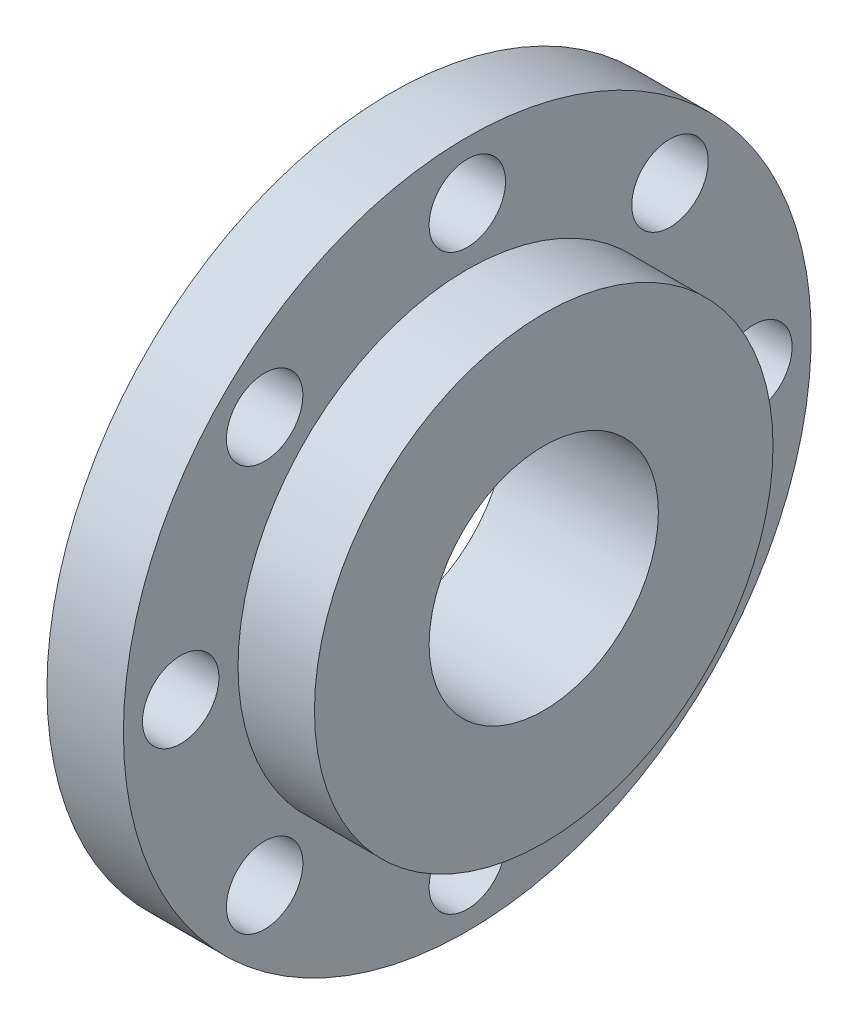
ISO-10303-21;
HEADER;
FILE_DESCRIPTION(('STEP AP214'),'2;1');
FILE_NAME('part.step','',(''),(''),'','','');
FILE_SCHEMA(('AUTOMOTIVE_DESIGN { 1 0 10303 214 1 1 1 1 }'));
ENDSEC;
DATA;
#1=APPLICATION_CONTEXT('core data for automotive mechanical design processes');
#2=APPLICATION_PROTOCOL_DEFINITION('international standard','automotive_design',2000,#1);
#3=PRODUCT_CONTEXT('',#1,'mechanical');
#4=PRODUCT('Part','Part','',(#3));
#5=PRODUCT_RELATED_PRODUCT_CATEGORY('part','',(#4));
#6=PRODUCT_DEFINITION_FORMATION('','',#4);
#7=PRODUCT_DEFINITION_CONTEXT('part definition',#1,'design');
#8=PRODUCT_DEFINITION('design','',#6,#7);
#9=PRODUCT_DEFINITION_SHAPE('','',#8);
#10=(LENGTH_UNIT() NAMED_UNIT(*) SI_UNIT(.MILLI.,.METRE.));
#11=(NAMED_UNIT(*) PLANE_ANGLE_UNIT() SI_UNIT($,.RADIAN.));
#12=(NAMED_UNIT(*) SI_UNIT($,.STERADIAN.) SOLID_ANGLE_UNIT());
#13=UNCERTAINTY_MEASURE_WITH_UNIT(LENGTH_MEASURE(1.E-05),#10,'distance_accuracy_value','');
#14=(GEOMETRIC_REPRESENTATION_CONTEXT(3) GLOBAL_UNCERTAINTY_ASSIGNED_CONTEXT((#13)) GLOBAL_UNIT_ASSIGNED_CONTEXT((#10,
#11,#12)) REPRESENTATION_CONTEXT('',''));
#15=CARTESIAN_POINT('',(0.,0.,0.));
#16=DIRECTION('',(0.,0.,1.));
#17=DIRECTION('',(1.,0.,0.));
#18=AXIS2_PLACEMENT_3D('',#15,#16,#17);
#19=CARTESIAN_POINT('',(0.,45.,0.));
#20=DIRECTION('',(1.,0.,0.));
#21=DIRECTION('',(0.,0.,-1.));
#22=AXIS2_PLACEMENT_3D('',#19,#20,#21);
#23=PLANE('',#22);
#24=CARTESIAN_POINT('',(0.,37.5,0.));
#25=DIRECTION('',(-1.,0.,0.));
#26=DIRECTION('',(0.,0.,1.));
#27=AXIS2_PLACEMENT_3D('',#24,#25,#26);
#28=CIRCLE('',#27,5.);
#29=CARTESIAN_POINT('',(0.,37.5,5.));
#30=VERTEX_POINT('',#29);
#31=EDGE_CURVE('E50',#30,#30,#28,.T.);
#32=ORIENTED_EDGE('',*,*,#31,.F.);
#33=EDGE_LOOP('',(#32));
#34=FACE_BOUND('',#33,.T.);
#35=CARTESIAN_POINT('',(0.,26.5165042944955,26.5165042944955));
#36=DIRECTION('',(-1.,0.,0.));
#37=DIRECTION('',(0.,0.,1.));
#38=AXIS2_PLACEMENT_3D('',#35,#36,#37);
#39=CIRCLE('',#38,5.);
#40=CARTESIAN_POINT('',(0.,26.5165042944955,31.5165042944955));
#41=VERTEX_POINT('',#40);
#42=EDGE_CURVE('E149',#41,#41,#39,.T.);
#43=ORIENTED_EDGE('',*,*,#42,.F.);
#44=EDGE_LOOP('',(#43));
#45=FACE_BOUND('',#44,.T.);
#46=CARTESIAN_POINT('',(0.,0.,37.5));
#47=DIRECTION('',(-1.,0.,0.));
#48=DIRECTION('',(0.,0.,1.));
#49=AXIS2_PLACEMENT_3D('',#46,#47,#48);
#50=CIRCLE('',#49,5.);
#51=CARTESIAN_POINT('',(0.,0.,42.5));
#52=VERTEX_POINT('',#51);
#53=EDGE_CURVE('E152',#52,#52,#50,.T.);
#54=ORIENTED_EDGE('',*,*,#53,.F.);
#55=EDGE_LOOP('',(#54));
#56=FACE_BOUND('',#55,.T.);
#57=CARTESIAN_POINT('',(0.,-26.5165042944955,26.5165042944955));
#58=DIRECTION('',(-1.,0.,0.));
#59=DIRECTION('',(0.,0.,1.));
#60=AXIS2_PLACEMENT_3D('',#57,#58,#59);
#61=CIRCLE('',#60,5.);
#62=CARTESIAN_POINT('',(0.,-26.5165042944955,31.5165042944955));
#63=VERTEX_POINT('',#62);
#64=EDGE_CURVE('E157',#63,#63,#61,.T.);
#65=ORIENTED_EDGE('',*,*,#64,.F.);
#66=EDGE_LOOP('',(#65));
#67=FACE_BOUND('',#66,.T.);
#68=CARTESIAN_POINT('',(0.,-37.5,0.));
#69=DIRECTION('',(-1.,0.,0.));
#70=DIRECTION('',(0.,0.,1.));
#71=AXIS2_PLACEMENT_3D('',#68,#69,#70);
#72=CIRCLE('',#71,5.);
#73=CARTESIAN_POINT('',(0.,-37.5,5.00000000000001));
#74=VERTEX_POINT('',#73);
#75=EDGE_CURVE('E160',#74,#74,#72,.T.);
#76=ORIENTED_EDGE('',*,*,#75,.F.);
#77=EDGE_LOOP('',(#76));
#78=FACE_BOUND('',#77,.T.);
#79=CARTESIAN_POINT('',(0.,-26.5165042944955,-26.5165042944955));
#80=DIRECTION('',(-1.,0.,0.));
#81=DIRECTION('',(0.,0.,1.));
#82=AXIS2_PLACEMENT_3D('',#79,#80,#81);
#83=CIRCLE('',#82,5.);
#84=CARTESIAN_POINT('',(0.,-26.5165042944955,-21.5165042944955));
#85=VERTEX_POINT('',#84);
#86=EDGE_CURVE('E163',#85,#85,#83,.T.);
#87=ORIENTED_EDGE('',*,*,#86,.F.);
#88=EDGE_LOOP('',(#87));
#89=FACE_BOUND('',#88,.T.);
#90=CARTESIAN_POINT('',(0.,0.,-37.5));
#91=DIRECTION('',(-1.,0.,0.));
#92=DIRECTION('',(0.,0.,1.));
#93=AXIS2_PLACEMENT_3D('',#90,#91,#92);
#94=CIRCLE('',#93,5.);
#95=CARTESIAN_POINT('',(0.,0.,-32.5));
#96=VERTEX_POINT('',#95);
#97=EDGE_CURVE('E165',#96,#96,#94,.T.);
#98=ORIENTED_EDGE('',*,*,#97,.F.);
#99=EDGE_LOOP('',(#98));
#100=FACE_BOUND('',#99,.T.);
#101=CARTESIAN_POINT('',(0.,26.5165042944955,-26.5165042944955));
#102=DIRECTION('',(-1.,0.,0.));
#103=DIRECTION('',(0.,0.,1.));
#104=AXIS2_PLACEMENT_3D('',#101,#102,#103);
#105=CIRCLE('',#104,5.);
#106=CARTESIAN_POINT('',(0.,26.5165042944955,-21.5165042944955));
#107=VERTEX_POINT('',#106);
#108=EDGE_CURVE('E81',#107,#107,#105,.T.);
#109=ORIENTED_EDGE('',*,*,#108,.F.);
#110=EDGE_LOOP('',(#109));
#111=FACE_BOUND('',#110,.T.);
#112=CARTESIAN_POINT('',(0.,0.,0.));
#113=DIRECTION('',(-1.,0.,0.));
#114=DIRECTION('',(0.,0.,1.));
#115=AXIS2_PLACEMENT_3D('',#112,#113,#114);
#116=CIRCLE('',#115,15.);
#117=CARTESIAN_POINT('',(0.,0.,15.));
#118=VERTEX_POINT('',#117);
#119=EDGE_CURVE('E10',#118,#118,#116,.T.);
#120=ORIENTED_EDGE('',*,*,#119,.F.);
#121=EDGE_LOOP('',(#120));
#122=FACE_BOUND('',#121,.T.);
#123=CARTESIAN_POINT('',(0.,0.,0.));
#124=DIRECTION('',(-1.,0.,0.));
#125=DIRECTION('',(0.,0.,1.));
#126=AXIS2_PLACEMENT_3D('',#123,#124,#125);
#127=CIRCLE('',#126,45.);
#128=CARTESIAN_POINT('',(0.,0.,45.));
#129=VERTEX_POINT('',#128);
#130=EDGE_CURVE('E69',#129,#129,#127,.T.);
#131=ORIENTED_EDGE('',*,*,#130,.T.);
#132=EDGE_LOOP('',(#131));
#133=FACE_BOUND('',#132,.T.);
#134=ADVANCED_FACE('F30',(#34,#45,#56,#67,#78,#89,#100,#111,#122,#133),#23,.F.);
#135=CARTESIAN_POINT('',(0.,0.,0.));
#136=DIRECTION('',(-1.,0.,0.));
#137=DIRECTION('',(0.,0.,1.));
#138=AXIS2_PLACEMENT_3D('',#135,#136,#137);
#139=CYLINDRICAL_SURFACE('',#138,15.);
#140=CARTESIAN_POINT('',(20.,0.,0.));
#141=DIRECTION('',(-1.,0.,0.));
#142=DIRECTION('',(0.,0.,1.));
#143=AXIS2_PLACEMENT_3D('',#140,#141,#142);
#144=CIRCLE('',#143,15.);
#145=CARTESIAN_POINT('',(20.,0.,15.));
#146=VERTEX_POINT('',#145);
#147=EDGE_CURVE('E37',#146,#146,#144,.T.);
#148=ORIENTED_EDGE('',*,*,#147,.F.);
#149=EDGE_LOOP('',(#148));
#150=FACE_BOUND('',#149,.T.);
#151=ORIENTED_EDGE('',*,*,#119,.T.);
#152=EDGE_LOOP('',(#151));
#153=FACE_BOUND('',#152,.T.);
#154=ADVANCED_FACE('F93',(#150,#153),#139,.F.);
#155=CARTESIAN_POINT('',(20.,15.,0.));
#156=DIRECTION('',(-1.,0.,0.));
#157=DIRECTION('',(0.,0.,1.));
#158=AXIS2_PLACEMENT_3D('',#155,#156,#157);
#159=PLANE('',#158);
#160=CARTESIAN_POINT('',(20.,0.,0.));
#161=DIRECTION('',(-1.,0.,0.));
#162=DIRECTION('',(0.,0.,1.));
#163=AXIS2_PLACEMENT_3D('',#160,#161,#162);
#164=CIRCLE('',#163,30.);
#165=CARTESIAN_POINT('',(20.,0.,30.));
#166=VERTEX_POINT('',#165);
#167=EDGE_CURVE('E42',#166,#166,#164,.T.);
#168=ORIENTED_EDGE('',*,*,#167,.F.);
#169=EDGE_LOOP('',(#168));
#170=FACE_BOUND('',#169,.T.);
#171=ORIENTED_EDGE('',*,*,#147,.T.);
#172=EDGE_LOOP('',(#171));
#173=FACE_BOUND('',#172,.T.);
#174=ADVANCED_FACE('F90',(#170,#173),#159,.F.);
#175=CARTESIAN_POINT('',(0.,0.,0.));
#176=DIRECTION('',(-1.,0.,0.));
#177=DIRECTION('',(0.,0.,1.));
#178=AXIS2_PLACEMENT_3D('',#175,#176,#177);
#179=CYLINDRICAL_SURFACE('',#178,30.);
#180=CARTESIAN_POINT('',(10.,0.,0.));
#181=DIRECTION('',(-1.,0.,0.));
#182=DIRECTION('',(0.,0.,1.));
#183=AXIS2_PLACEMENT_3D('',#180,#181,#182);
#184=CIRCLE('',#183,30.);
#185=CARTESIAN_POINT('',(10.,0.,30.));
#186=VERTEX_POINT('',#185);
#187=EDGE_CURVE('E78',#186,#186,#184,.T.);
#188=ORIENTED_EDGE('',*,*,#187,.F.);
#189=EDGE_LOOP('',(#188));
#190=FACE_BOUND('',#189,.T.);
#191=ORIENTED_EDGE('',*,*,#167,.T.);
#192=EDGE_LOOP('',(#191));
#193=FACE_BOUND('',#192,.T.);
#194=ADVANCED_FACE('F88',(#190,#193),#179,.T.);
#195=CARTESIAN_POINT('',(10.,30.,0.));
#196=DIRECTION('',(-1.,0.,0.));
#197=DIRECTION('',(0.,0.,1.));
#198=AXIS2_PLACEMENT_3D('',#195,#196,#197);
#199=PLANE('',#198);
#200=CARTESIAN_POINT('',(10.,37.5,0.));
#201=DIRECTION('',(-1.,0.,0.));
#202=DIRECTION('',(0.,0.,1.));
#203=AXIS2_PLACEMENT_3D('',#200,#201,#202);
#204=CIRCLE('',#203,5.);
#205=CARTESIAN_POINT('',(10.,37.5,5.));
#206=VERTEX_POINT('',#205);
#207=EDGE_CURVE('E33',#206,#206,#204,.T.);
#208=ORIENTED_EDGE('',*,*,#207,.T.);
#209=EDGE_LOOP('',(#208));
#210=FACE_BOUND('',#209,.T.);
#211=CARTESIAN_POINT('',(10.,26.5165042944955,26.5165042944955));
#212=DIRECTION('',(-1.,0.,0.));
#213=DIRECTION('',(0.,0.,1.));
#214=AXIS2_PLACEMENT_3D('',#211,#212,#213);
#215=CIRCLE('',#214,5.);
#216=CARTESIAN_POINT('',(10.,26.5165042944955,31.5165042944955));
#217=VERTEX_POINT('',#216);
#218=EDGE_CURVE('E64',#217,#217,#215,.T.);
#219=ORIENTED_EDGE('',*,*,#218,.T.);
#220=EDGE_LOOP('',(#219));
#221=FACE_BOUND('',#220,.T.);
#222=CARTESIAN_POINT('',(10.,0.,37.5));
#223=DIRECTION('',(-1.,0.,0.));
#224=DIRECTION('',(0.,0.,1.));
#225=AXIS2_PLACEMENT_3D('',#222,#223,#224);
#226=CIRCLE('',#225,5.);
#227=CARTESIAN_POINT('',(10.,0.,42.5));
#228=VERTEX_POINT('',#227);
#229=EDGE_CURVE('E62',#228,#228,#226,.T.);
#230=ORIENTED_EDGE('',*,*,#229,.T.);
#231=EDGE_LOOP('',(#230));
#232=FACE_BOUND('',#231,.T.);
#233=CARTESIAN_POINT('',(10.,-26.5165042944955,26.5165042944955));
#234=DIRECTION('',(-1.,0.,0.));
#235=DIRECTION('',(0.,0.,1.));
#236=AXIS2_PLACEMENT_3D('',#233,#234,#235);
#237=CIRCLE('',#236,5.);
#238=CARTESIAN_POINT('',(10.,-26.5165042944955,31.5165042944955));
#239=VERTEX_POINT('',#238);
#240=EDGE_CURVE('E59',#239,#239,#237,.T.);
#241=ORIENTED_EDGE('',*,*,#240,.T.);
#242=EDGE_LOOP('',(#241));
#243=FACE_BOUND('',#242,.T.);
#244=CARTESIAN_POINT('',(10.,-37.5,0.));
#245=DIRECTION('',(-1.,0.,0.));
#246=DIRECTION('',(0.,0.,1.));
#247=AXIS2_PLACEMENT_3D('',#244,#245,#246);
#248=CIRCLE('',#247,5.);
#249=CARTESIAN_POINT('',(10.,-37.5,5.00000000000001));
#250=VERTEX_POINT('',#249);
#251=EDGE_CURVE('E56',#250,#250,#248,.T.);
#252=ORIENTED_EDGE('',*,*,#251,.T.);
#253=EDGE_LOOP('',(#252));
#254=FACE_BOUND('',#253,.T.);
#255=CARTESIAN_POINT('',(10.,-26.5165042944955,-26.5165042944955));
#256=DIRECTION('',(-1.,0.,0.));
#257=DIRECTION('',(0.,0.,1.));
#258=AXIS2_PLACEMENT_3D('',#255,#256,#257);
#259=CIRCLE('',#258,5.);
#260=CARTESIAN_POINT('',(10.,-26.5165042944955,-21.5165042944955));
#261=VERTEX_POINT('',#260);
#262=EDGE_CURVE('E53',#261,#261,#259,.T.);
#263=ORIENTED_EDGE('',*,*,#262,.T.);
#264=EDGE_LOOP('',(#263));
#265=FACE_BOUND('',#264,.T.);
#266=CARTESIAN_POINT('',(10.,0.,-37.5));
#267=DIRECTION('',(-1.,0.,0.));
#268=DIRECTION('',(0.,0.,1.));
#269=AXIS2_PLACEMENT_3D('',#266,#267,#268);
#270=CIRCLE('',#269,5.);
#271=CARTESIAN_POINT('',(10.,0.,-32.5));
#272=VERTEX_POINT('',#271);
#273=EDGE_CURVE('E49',#272,#272,#270,.T.);
#274=ORIENTED_EDGE('',*,*,#273,.T.);
#275=EDGE_LOOP('',(#274));
#276=FACE_BOUND('',#275,.T.);
#277=CARTESIAN_POINT('',(10.,26.5165042944955,-26.5165042944955));
#278=DIRECTION('',(-1.,0.,0.));
#279=DIRECTION('',(0.,0.,1.));
#280=AXIS2_PLACEMENT_3D('',#277,#278,#279);
#281=CIRCLE('',#280,5.);
#282=CARTESIAN_POINT('',(10.,26.5165042944955,-21.5165042944955));
#283=VERTEX_POINT('',#282);
#284=EDGE_CURVE('E46',#283,#283,#281,.T.);
#285=ORIENTED_EDGE('',*,*,#284,.T.);
#286=EDGE_LOOP('',(#285));
#287=FACE_BOUND('',#286,.T.);
#288=CARTESIAN_POINT('',(10.,0.,0.));
#289=DIRECTION('',(-1.,0.,0.));
#290=DIRECTION('',(0.,0.,1.));
#291=AXIS2_PLACEMENT_3D('',#288,#289,#290);
#292=CIRCLE('',#291,45.);
#293=CARTESIAN_POINT('',(10.,0.,45.));
#294=VERTEX_POINT('',#293);
#295=EDGE_CURVE('E73',#294,#294,#292,.T.);
#296=ORIENTED_EDGE('',*,*,#295,.F.);
#297=EDGE_LOOP('',(#296));
#298=FACE_BOUND('',#297,.T.);
#299=ORIENTED_EDGE('',*,*,#187,.T.);
#300=EDGE_LOOP('',(#299));
#301=FACE_BOUND('',#300,.T.);
#302=ADVANCED_FACE('F105',(#210,#221,#232,#243,#254,#265,#276,#287,#298,#301),#199,.F.);
#303=CARTESIAN_POINT('',(0.,0.,0.));
#304=DIRECTION('',(-1.,0.,0.));
#305=DIRECTION('',(0.,0.,1.));
#306=AXIS2_PLACEMENT_3D('',#303,#304,#305);
#307=CYLINDRICAL_SURFACE('',#306,45.);
#308=ORIENTED_EDGE('',*,*,#130,.F.);
#309=EDGE_LOOP('',(#308));
#310=FACE_BOUND('',#309,.T.);
#311=ORIENTED_EDGE('',*,*,#295,.T.);
#312=EDGE_LOOP('',(#311));
#313=FACE_BOUND('',#312,.T.);
#314=ADVANCED_FACE('F109',(#310,#313),#307,.T.);
#315=CARTESIAN_POINT('',(20.,26.5165042944955,-26.5165042944955));
#316=DIRECTION('',(-1.,0.,0.));
#317=DIRECTION('',(0.,0.,1.));
#318=AXIS2_PLACEMENT_3D('',#315,#316,#317);
#319=CYLINDRICAL_SURFACE('',#318,5.);
#320=ORIENTED_EDGE('',*,*,#108,.T.);
#321=EDGE_LOOP('',(#320));
#322=FACE_BOUND('',#321,.T.);
#323=ORIENTED_EDGE('',*,*,#284,.F.);
#324=EDGE_LOOP('',(#323));
#325=FACE_BOUND('',#324,.T.);
#326=ADVANCED_FACE('F112',(#322,#325),#319,.F.);
#327=CARTESIAN_POINT('',(20.,0.,-37.5));
#328=DIRECTION('',(-1.,0.,0.));
#329=DIRECTION('',(0.,0.,1.));
#330=AXIS2_PLACEMENT_3D('',#327,#328,#329);
#331=CYLINDRICAL_SURFACE('',#330,5.);
#332=ORIENTED_EDGE('',*,*,#97,.T.);
#333=EDGE_LOOP('',(#332));
#334=FACE_BOUND('',#333,.T.);
#335=ORIENTED_EDGE('',*,*,#273,.F.);
#336=EDGE_LOOP('',(#335));
#337=FACE_BOUND('',#336,.T.);
#338=ADVANCED_FACE('F116',(#334,#337),#331,.F.);
#339=CARTESIAN_POINT('',(20.,-26.5165042944955,-26.5165042944955));
#340=DIRECTION('',(-1.,0.,0.));
#341=DIRECTION('',(0.,0.,1.));
#342=AXIS2_PLACEMENT_3D('',#339,#340,#341);
#343=CYLINDRICAL_SURFACE('',#342,5.);
#344=ORIENTED_EDGE('',*,*,#86,.T.);
#345=EDGE_LOOP('',(#344));
#346=FACE_BOUND('',#345,.T.);
#347=ORIENTED_EDGE('',*,*,#262,.F.);
#348=EDGE_LOOP('',(#347));
#349=FACE_BOUND('',#348,.T.);
#350=ADVANCED_FACE('F120',(#346,#349),#343,.F.);
#351=CARTESIAN_POINT('',(20.,-37.5,0.));
#352=DIRECTION('',(-1.,0.,0.));
#353=DIRECTION('',(0.,0.,1.));
#354=AXIS2_PLACEMENT_3D('',#351,#352,#353);
#355=CYLINDRICAL_SURFACE('',#354,5.);
#356=ORIENTED_EDGE('',*,*,#75,.T.);
#357=EDGE_LOOP('',(#356));
#358=FACE_BOUND('',#357,.T.);
#359=ORIENTED_EDGE('',*,*,#251,.F.);
#360=EDGE_LOOP('',(#359));
#361=FACE_BOUND('',#360,.T.);
#362=ADVANCED_FACE('F124',(#358,#361),#355,.F.);
#363=CARTESIAN_POINT('',(20.,-26.5165042944955,26.5165042944955));
#364=DIRECTION('',(-1.,0.,0.));
#365=DIRECTION('',(0.,0.,1.));
#366=AXIS2_PLACEMENT_3D('',#363,#364,#365);
#367=CYLINDRICAL_SURFACE('',#366,5.);
#368=ORIENTED_EDGE('',*,*,#64,.T.);
#369=EDGE_LOOP('',(#368));
#370=FACE_BOUND('',#369,.T.);
#371=ORIENTED_EDGE('',*,*,#240,.F.);
#372=EDGE_LOOP('',(#371));
#373=FACE_BOUND('',#372,.T.);
#374=ADVANCED_FACE('F128',(#370,#373),#367,.F.);
#375=CARTESIAN_POINT('',(20.,0.,37.5));
#376=DIRECTION('',(-1.,0.,0.));
#377=DIRECTION('',(0.,0.,1.));
#378=AXIS2_PLACEMENT_3D('',#375,#376,#377);
#379=CYLINDRICAL_SURFACE('',#378,5.);
#380=ORIENTED_EDGE('',*,*,#53,.T.);
#381=EDGE_LOOP('',(#380));
#382=FACE_BOUND('',#381,.T.);
#383=ORIENTED_EDGE('',*,*,#229,.F.);
#384=EDGE_LOOP('',(#383));
#385=FACE_BOUND('',#384,.T.);
#386=ADVANCED_FACE('F132',(#382,#385),#379,.F.);
#387=CARTESIAN_POINT('',(20.,26.5165042944955,26.5165042944955));
#388=DIRECTION('',(-1.,0.,0.));
#389=DIRECTION('',(0.,0.,1.));
#390=AXIS2_PLACEMENT_3D('',#387,#388,#389);
#391=CYLINDRICAL_SURFACE('',#390,5.);
#392=ORIENTED_EDGE('',*,*,#42,.T.);
#393=EDGE_LOOP('',(#392));
#394=FACE_BOUND('',#393,.T.);
#395=ORIENTED_EDGE('',*,*,#218,.F.);
#396=EDGE_LOOP('',(#395));
#397=FACE_BOUND('',#396,.T.);
#398=ADVANCED_FACE('F136',(#394,#397),#391,.F.);
#399=CARTESIAN_POINT('',(20.,37.5,0.));
#400=DIRECTION('',(-1.,0.,0.));
#401=DIRECTION('',(0.,0.,1.));
#402=AXIS2_PLACEMENT_3D('',#399,#400,#401);
#403=CYLINDRICAL_SURFACE('',#402,5.);
#404=ORIENTED_EDGE('',*,*,#31,.T.);
#405=EDGE_LOOP('',(#404));
#406=FACE_BOUND('',#405,.T.);
#407=ORIENTED_EDGE('',*,*,#207,.F.);
#408=EDGE_LOOP('',(#407));
#409=FACE_BOUND('',#408,.T.);
#410=ADVANCED_FACE('F140',(#406,#409),#403,.F.);
#411=CLOSED_SHELL('',(#134,#154,#174,#194,#302,#314,#326,#338,#350,#362,#374,#386,#398,#410));
#412=MANIFOLD_SOLID_BREP('B2',#411);
#413=ADVANCED_BREP_SHAPE_REPRESENTATION('',(#18,#412),#14);
#414=SHAPE_DEFINITION_REPRESENTATION(#9,#413);
ENDSEC;
END-ISO-10303-21;
